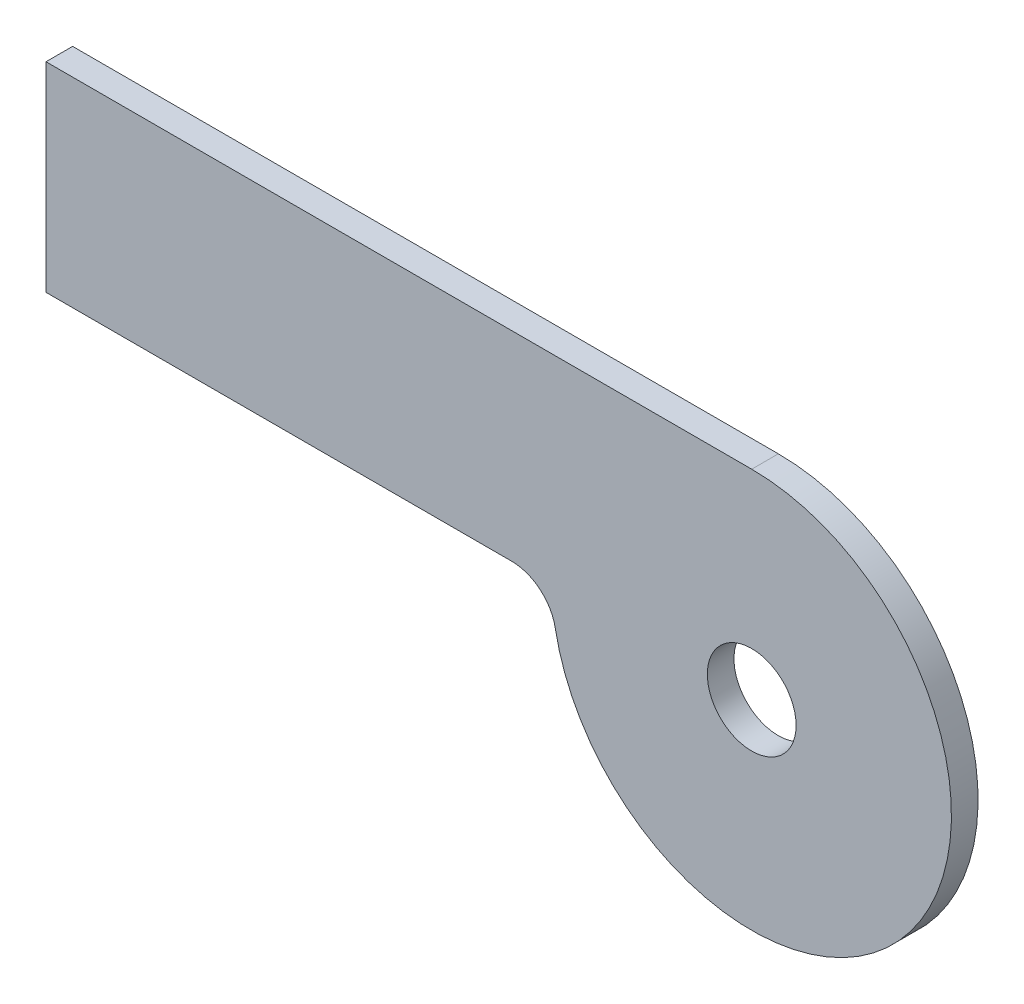
ISO-10303-21;
HEADER;
FILE_DESCRIPTION(('STEP AP214'),'2;1');
FILE_NAME('part.step','',(''),(''),'','','');
FILE_SCHEMA(('AUTOMOTIVE_DESIGN { 1 0 10303 214 1 1 1 1 }'));
ENDSEC;
DATA;
#1=APPLICATION_CONTEXT('core data for automotive mechanical design processes');
#2=APPLICATION_PROTOCOL_DEFINITION('international standard','automotive_design',2000,#1);
#3=PRODUCT_CONTEXT('',#1,'mechanical');
#4=PRODUCT('Part','Part','',(#3));
#5=PRODUCT_RELATED_PRODUCT_CATEGORY('part','',(#4));
#6=PRODUCT_DEFINITION_FORMATION('','',#4);
#7=PRODUCT_DEFINITION_CONTEXT('part definition',#1,'design');
#8=PRODUCT_DEFINITION('design','',#6,#7);
#9=PRODUCT_DEFINITION_SHAPE('','',#8);
#10=(LENGTH_UNIT() NAMED_UNIT(*) SI_UNIT(.MILLI.,.METRE.));
#11=(NAMED_UNIT(*) PLANE_ANGLE_UNIT() SI_UNIT($,.RADIAN.));
#12=(NAMED_UNIT(*) SI_UNIT($,.STERADIAN.) SOLID_ANGLE_UNIT());
#13=UNCERTAINTY_MEASURE_WITH_UNIT(LENGTH_MEASURE(1.E-05),#10,'distance_accuracy_value','');
#14=(GEOMETRIC_REPRESENTATION_CONTEXT(3) GLOBAL_UNCERTAINTY_ASSIGNED_CONTEXT((#13)) GLOBAL_UNIT_ASSIGNED_CONTEXT((#10,
#11,#12)) REPRESENTATION_CONTEXT('',''));
#15=CARTESIAN_POINT('',(0.,0.,0.));
#16=DIRECTION('',(0.,0.,1.));
#17=DIRECTION('',(1.,0.,0.));
#18=AXIS2_PLACEMENT_3D('',#15,#16,#17);
#19=CARTESIAN_POINT('',(0.,22.5,3.));
#20=DIRECTION('',(0.,-1.,0.));
#21=DIRECTION('',(1.,0.,0.));
#22=AXIS2_PLACEMENT_3D('',#19,#20,#21);
#23=PLANE('',#22);
#24=DIRECTION('',(-1.,0.,0.));
#25=VECTOR('',#24,1.);
#26=CARTESIAN_POINT('',(0.,22.5,0.));
#27=LINE('',#26,#25);
#28=CARTESIAN_POINT('',(0.,22.5,0.));
#29=VERTEX_POINT('',#28);
#30=CARTESIAN_POINT('',(-79.5,22.5,0.));
#31=VERTEX_POINT('',#30);
#32=EDGE_CURVE('E205',#29,#31,#27,.T.);
#33=ORIENTED_EDGE('',*,*,#32,.T.);
#34=DIRECTION('',(0.,0.,-1.));
#35=VECTOR('',#34,1.);
#36=CARTESIAN_POINT('',(-79.5,22.5,3.));
#37=LINE('',#36,#35);
#38=CARTESIAN_POINT('',(-79.5,22.5,3.));
#39=VERTEX_POINT('',#38);
#40=EDGE_CURVE('E125',#39,#31,#37,.T.);
#41=ORIENTED_EDGE('',*,*,#40,.F.);
#42=DIRECTION('',(-1.,0.,0.));
#43=VECTOR('',#42,1.);
#44=CARTESIAN_POINT('',(0.,22.5,3.));
#45=LINE('',#44,#43);
#46=CARTESIAN_POINT('',(0.,22.5,3.));
#47=VERTEX_POINT('',#46);
#48=EDGE_CURVE('E190',#47,#39,#45,.T.);
#49=ORIENTED_EDGE('',*,*,#48,.F.);
#50=DIRECTION('',(0.,0.,-1.));
#51=VECTOR('',#50,1.);
#52=CARTESIAN_POINT('',(0.,22.5,3.));
#53=LINE('',#52,#51);
#54=EDGE_CURVE('E167',#47,#29,#53,.T.);
#55=ORIENTED_EDGE('',*,*,#54,.T.);
#56=EDGE_LOOP('',(#33,#41,#49,#55));
#57=FACE_BOUND('',#56,.T.);
#58=ADVANCED_FACE('F114',(#57),#23,.F.);
#59=CARTESIAN_POINT('',(-79.5,0.,3.));
#60=DIRECTION('',(1.,0.,0.));
#61=DIRECTION('',(0.,0.,-1.));
#62=AXIS2_PLACEMENT_3D('',#59,#60,#61);
#63=PLANE('',#62);
#64=DIRECTION('',(0.,-1.,0.));
#65=VECTOR('',#64,1.);
#66=CARTESIAN_POINT('',(-79.5,0.,0.));
#67=LINE('',#66,#65);
#68=CARTESIAN_POINT('',(-79.5,0.,0.));
#69=VERTEX_POINT('',#68);
#70=EDGE_CURVE('E155',#31,#69,#67,.T.);
#71=ORIENTED_EDGE('',*,*,#70,.T.);
#72=DIRECTION('',(0.,0.,-1.));
#73=VECTOR('',#72,1.);
#74=CARTESIAN_POINT('',(-79.5,0.,3.));
#75=LINE('',#74,#73);
#76=CARTESIAN_POINT('',(-79.5,0.,3.));
#77=VERTEX_POINT('',#76);
#78=EDGE_CURVE('E185',#77,#69,#75,.T.);
#79=ORIENTED_EDGE('',*,*,#78,.F.);
#80=DIRECTION('',(0.,-1.,0.));
#81=VECTOR('',#80,1.);
#82=CARTESIAN_POINT('',(-79.5,0.,3.));
#83=LINE('',#82,#81);
#84=EDGE_CURVE('E174',#39,#77,#83,.T.);
#85=ORIENTED_EDGE('',*,*,#84,.F.);
#86=ORIENTED_EDGE('',*,*,#40,.T.);
#87=EDGE_LOOP('',(#71,#79,#85,#86));
#88=FACE_BOUND('',#87,.T.);
#89=ADVANCED_FACE('F245',(#88),#63,.F.);
#90=CARTESIAN_POINT('',(0.,0.,3.));
#91=DIRECTION('',(0.,-1.,0.));
#92=DIRECTION('',(1.,0.,0.));
#93=AXIS2_PLACEMENT_3D('',#90,#91,#92);
#94=PLANE('',#93);
#95=DIRECTION('',(0.,0.,-1.));
#96=VECTOR('',#95,1.);
#97=CARTESIAN_POINT('',(-27.0416345659799,0.,3.));
#98=LINE('',#97,#96);
#99=CARTESIAN_POINT('',(-27.0416345659799,0.,3.));
#100=VERTEX_POINT('',#99);
#101=CARTESIAN_POINT('',(-27.0416345659799,0.,0.));
#102=VERTEX_POINT('',#101);
#103=EDGE_CURVE('E12',#100,#102,#98,.T.);
#104=ORIENTED_EDGE('',*,*,#103,.F.);
#105=DIRECTION('',(-1.,0.,0.));
#106=VECTOR('',#105,1.);
#107=CARTESIAN_POINT('',(0.,0.,3.));
#108=LINE('',#107,#106);
#109=EDGE_CURVE('E178',#100,#77,#108,.T.);
#110=ORIENTED_EDGE('',*,*,#109,.T.);
#111=ORIENTED_EDGE('',*,*,#78,.T.);
#112=DIRECTION('',(-1.,0.,0.));
#113=VECTOR('',#112,1.);
#114=CARTESIAN_POINT('',(0.,0.,0.));
#115=LINE('',#114,#113);
#116=EDGE_CURVE('E196',#102,#69,#115,.T.);
#117=ORIENTED_EDGE('',*,*,#116,.F.);
#118=EDGE_LOOP('',(#104,#110,#111,#117));
#119=FACE_BOUND('',#118,.T.);
#120=ADVANCED_FACE('F231',(#119),#94,.T.);
#121=CARTESIAN_POINT('',(0.,0.,0.));
#122=DIRECTION('',(0.,0.,1.));
#123=DIRECTION('',(1.,0.,0.));
#124=AXIS2_PLACEMENT_3D('',#121,#122,#123);
#125=PLANE('',#124);
#126=CARTESIAN_POINT('',(0.,0.,0.));
#127=DIRECTION('',(0.,0.,1.));
#128=DIRECTION('',(1.,0.,0.));
#129=AXIS2_PLACEMENT_3D('',#126,#127,#128);
#130=CIRCLE('',#129,22.5);
#131=CARTESIAN_POINT('',(-22.1249737358017,-4.09090909090909,0.));
#132=VERTEX_POINT('',#131);
#133=EDGE_CURVE('E183',#132,#29,#130,.T.);
#134=ORIENTED_EDGE('',*,*,#133,.F.);
#135=CARTESIAN_POINT('',(-27.0416345659799,-5.,0.));
#136=DIRECTION('',(0.,0.,-1.));
#137=DIRECTION('',(-1.,0.,0.));
#138=AXIS2_PLACEMENT_3D('',#135,#136,#137);
#139=CIRCLE('',#138,5.);
#140=EDGE_CURVE('E118',#102,#132,#139,.T.);
#141=ORIENTED_EDGE('',*,*,#140,.F.);
#142=ORIENTED_EDGE('',*,*,#116,.T.);
#143=ORIENTED_EDGE('',*,*,#70,.F.);
#144=ORIENTED_EDGE('',*,*,#32,.F.);
#145=EDGE_LOOP('',(#134,#141,#142,#143,#144));
#146=FACE_BOUND('',#145,.T.);
#147=CARTESIAN_POINT('',(0.,0.,0.));
#148=DIRECTION('',(0.,0.,1.));
#149=DIRECTION('',(1.,0.,0.));
#150=AXIS2_PLACEMENT_3D('',#147,#148,#149);
#151=CIRCLE('',#150,5.);
#152=CARTESIAN_POINT('',(5.,0.,0.));
#153=VERTEX_POINT('',#152);
#154=EDGE_CURVE('E218',#153,#153,#151,.T.);
#155=ORIENTED_EDGE('',*,*,#154,.T.);
#156=EDGE_LOOP('',(#155));
#157=FACE_BOUND('',#156,.T.);
#158=ADVANCED_FACE('F228',(#146,#157),#125,.F.);
#159=CARTESIAN_POINT('',(0.,0.,3.));
#160=DIRECTION('',(0.,0.,1.));
#161=DIRECTION('',(1.,0.,0.));
#162=AXIS2_PLACEMENT_3D('',#159,#160,#161);
#163=PLANE('',#162);
#164=CARTESIAN_POINT('',(-27.0416345659799,-5.,3.));
#165=DIRECTION('',(0.,0.,-1.));
#166=DIRECTION('',(-1.,0.,0.));
#167=AXIS2_PLACEMENT_3D('',#164,#165,#166);
#168=CIRCLE('',#167,5.);
#169=CARTESIAN_POINT('',(-22.1249737358017,-4.09090909090909,3.));
#170=VERTEX_POINT('',#169);
#171=EDGE_CURVE('E192',#100,#170,#168,.T.);
#172=ORIENTED_EDGE('',*,*,#171,.T.);
#173=CARTESIAN_POINT('',(0.,0.,3.));
#174=DIRECTION('',(0.,0.,1.));
#175=DIRECTION('',(1.,0.,0.));
#176=AXIS2_PLACEMENT_3D('',#173,#174,#175);
#177=CIRCLE('',#176,22.5);
#178=EDGE_CURVE('E181',#170,#47,#177,.T.);
#179=ORIENTED_EDGE('',*,*,#178,.T.);
#180=ORIENTED_EDGE('',*,*,#48,.T.);
#181=ORIENTED_EDGE('',*,*,#84,.T.);
#182=ORIENTED_EDGE('',*,*,#109,.F.);
#183=EDGE_LOOP('',(#172,#179,#180,#181,#182));
#184=FACE_BOUND('',#183,.T.);
#185=CARTESIAN_POINT('',(0.,0.,3.));
#186=DIRECTION('',(0.,0.,1.));
#187=DIRECTION('',(1.,0.,0.));
#188=AXIS2_PLACEMENT_3D('',#185,#186,#187);
#189=CIRCLE('',#188,5.);
#190=CARTESIAN_POINT('',(5.,0.,3.));
#191=VERTEX_POINT('',#190);
#192=EDGE_CURVE('E214',#191,#191,#189,.T.);
#193=ORIENTED_EDGE('',*,*,#192,.F.);
#194=EDGE_LOOP('',(#193));
#195=FACE_BOUND('',#194,.T.);
#196=ADVANCED_FACE('F188',(#184,#195),#163,.T.);
#197=CARTESIAN_POINT('',(-27.0416345659799,-5.,3.));
#198=DIRECTION('',(0.,0.,-1.));
#199=DIRECTION('',(-1.,0.,0.));
#200=AXIS2_PLACEMENT_3D('',#197,#198,#199);
#201=CYLINDRICAL_SURFACE('',#200,5.);
#202=ORIENTED_EDGE('',*,*,#140,.T.);
#203=DIRECTION('',(0.,0.,-1.));
#204=VECTOR('',#203,1.);
#205=CARTESIAN_POINT('',(-22.1249737358017,-4.09090909090908,3.));
#206=LINE('',#205,#204);
#207=EDGE_CURVE('E142',#170,#132,#206,.T.);
#208=ORIENTED_EDGE('',*,*,#207,.F.);
#209=ORIENTED_EDGE('',*,*,#171,.F.);
#210=ORIENTED_EDGE('',*,*,#103,.T.);
#211=EDGE_LOOP('',(#202,#208,#209,#210));
#212=FACE_BOUND('',#211,.T.);
#213=ADVANCED_FACE('F116',(#212),#201,.F.);
#214=CARTESIAN_POINT('',(0.,0.,3.));
#215=DIRECTION('',(0.,0.,-1.));
#216=DIRECTION('',(-1.,0.,0.));
#217=AXIS2_PLACEMENT_3D('',#214,#215,#216);
#218=CYLINDRICAL_SURFACE('',#217,5.);
#219=ORIENTED_EDGE('',*,*,#192,.T.);
#220=EDGE_LOOP('',(#219));
#221=FACE_BOUND('',#220,.T.);
#222=ORIENTED_EDGE('',*,*,#154,.F.);
#223=EDGE_LOOP('',(#222));
#224=FACE_BOUND('',#223,.T.);
#225=ADVANCED_FACE('F235',(#221,#224),#218,.F.);
#226=CARTESIAN_POINT('',(0.,0.,3.));
#227=DIRECTION('',(0.,0.,-1.));
#228=DIRECTION('',(-1.,0.,0.));
#229=AXIS2_PLACEMENT_3D('',#226,#227,#228);
#230=CYLINDRICAL_SURFACE('',#229,22.5);
#231=ORIENTED_EDGE('',*,*,#54,.F.);
#232=ORIENTED_EDGE('',*,*,#178,.F.);
#233=ORIENTED_EDGE('',*,*,#207,.T.);
#234=ORIENTED_EDGE('',*,*,#133,.T.);
#235=EDGE_LOOP('',(#231,#232,#233,#234));
#236=FACE_BOUND('',#235,.T.);
#237=ADVANCED_FACE('F180',(#236),#230,.T.);
#238=CLOSED_SHELL('',(#58,#89,#120,#158,#196,#213,#225,#237));
#239=MANIFOLD_SOLID_BREP('B2',#238);
#240=ADVANCED_BREP_SHAPE_REPRESENTATION('',(#18,#239),#14);
#241=SHAPE_DEFINITION_REPRESENTATION(#9,#240);
ENDSEC;
END-ISO-10303-21;
